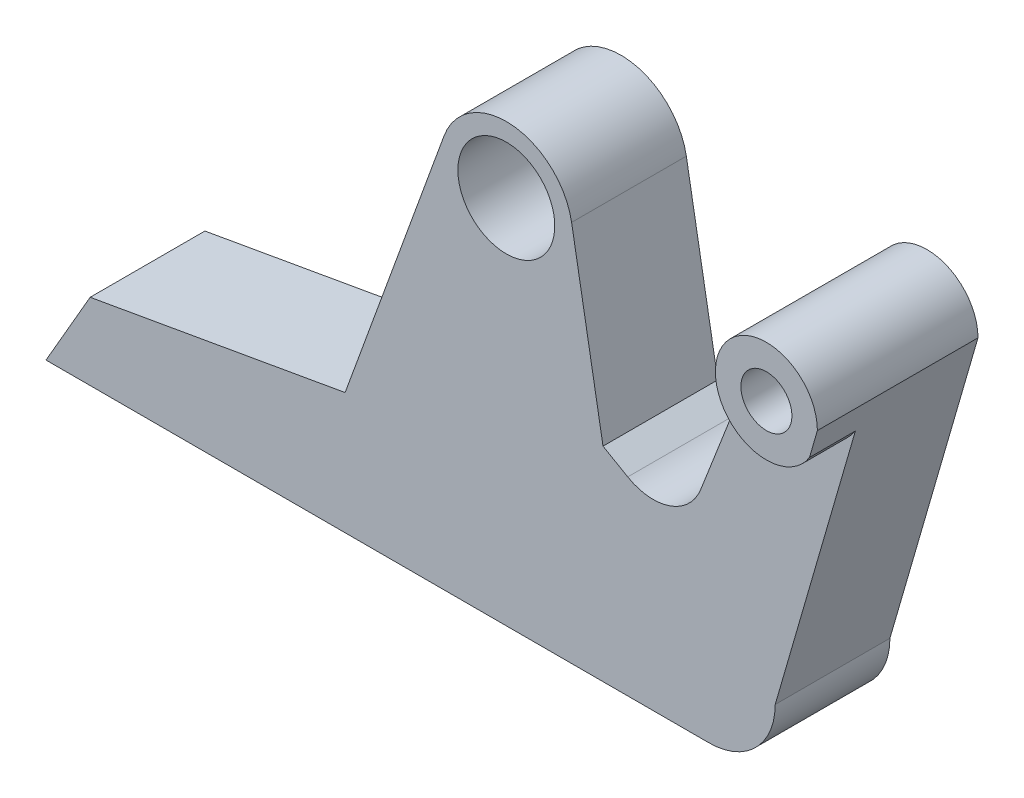
ISO-10303-21;
HEADER;
FILE_DESCRIPTION(('STEP AP214'),'2;1');
FILE_NAME('part.step','',(''),(''),'','','');
FILE_SCHEMA(('AUTOMOTIVE_DESIGN { 1 0 10303 214 1 1 1 1 }'));
ENDSEC;
DATA;
#1=APPLICATION_CONTEXT('core data for automotive mechanical design processes');
#2=APPLICATION_PROTOCOL_DEFINITION('international standard','automotive_design',2000,#1);
#3=PRODUCT_CONTEXT('',#1,'mechanical');
#4=PRODUCT('Part','Part','',(#3));
#5=PRODUCT_RELATED_PRODUCT_CATEGORY('part','',(#4));
#6=PRODUCT_DEFINITION_FORMATION('','',#4);
#7=PRODUCT_DEFINITION_CONTEXT('part definition',#1,'design');
#8=PRODUCT_DEFINITION('design','',#6,#7);
#9=PRODUCT_DEFINITION_SHAPE('','',#8);
#10=(LENGTH_UNIT() NAMED_UNIT(*) SI_UNIT(.MILLI.,.METRE.));
#11=(NAMED_UNIT(*) PLANE_ANGLE_UNIT() SI_UNIT($,.RADIAN.));
#12=(NAMED_UNIT(*) SI_UNIT($,.STERADIAN.) SOLID_ANGLE_UNIT());
#13=UNCERTAINTY_MEASURE_WITH_UNIT(LENGTH_MEASURE(1.E-05),#10,'distance_accuracy_value','');
#14=(GEOMETRIC_REPRESENTATION_CONTEXT(3) GLOBAL_UNCERTAINTY_ASSIGNED_CONTEXT((#13)) GLOBAL_UNIT_ASSIGNED_CONTEXT((#10,
#11,#12)) REPRESENTATION_CONTEXT('',''));
#15=CARTESIAN_POINT('',(0.,0.,0.));
#16=DIRECTION('',(0.,0.,1.));
#17=DIRECTION('',(1.,0.,0.));
#18=AXIS2_PLACEMENT_3D('',#15,#16,#17);
#19=CARTESIAN_POINT('',(0.,0.,22.5));
#20=DIRECTION('',(0.866025403784436,-0.500000000000004,0.));
#21=DIRECTION('',(0.500000000000004,0.866025403784436,0.));
#22=AXIS2_PLACEMENT_3D('',#19,#20,#21);
#23=PLANE('',#22);
#24=DIRECTION('',(-0.500000000000004,-0.866025403784436,0.));
#25=VECTOR('',#24,1.);
#26=CARTESIAN_POINT('',(0.,0.,8.24999999999999));
#27=LINE('',#26,#25);
#28=CARTESIAN_POINT('',(1.73205080756889,3.,8.24999999999999));
#29=VERTEX_POINT('',#28);
#30=CARTESIAN_POINT('',(0.,0.,8.24999999999999));
#31=VERTEX_POINT('',#30);
#32=EDGE_CURVE('E286',#29,#31,#27,.T.);
#33=ORIENTED_EDGE('',*,*,#32,.F.);
#34=DIRECTION('',(0.,0.,1.));
#35=VECTOR('',#34,1.);
#36=CARTESIAN_POINT('',(1.7320508075689,3.,22.5));
#37=LINE('',#36,#35);
#38=CARTESIAN_POINT('',(1.73205080756892,3.00000000000001,5.25));
#39=VERTEX_POINT('',#38);
#40=EDGE_CURVE('E385',#39,#29,#37,.T.);
#41=ORIENTED_EDGE('',*,*,#40,.F.);
#42=DIRECTION('',(-0.500000000000004,-0.866025403784436,0.));
#43=VECTOR('',#42,1.);
#44=CARTESIAN_POINT('',(0.,0.,5.25));
#45=LINE('',#44,#43);
#46=CARTESIAN_POINT('',(3.4641016151378,6.,5.25));
#47=VERTEX_POINT('',#46);
#48=EDGE_CURVE('E383',#47,#39,#45,.T.);
#49=ORIENTED_EDGE('',*,*,#48,.F.);
#50=DIRECTION('',(0.,0.,1.));
#51=VECTOR('',#50,1.);
#52=CARTESIAN_POINT('',(3.46410161513779,6.,22.5));
#53=LINE('',#52,#51);
#54=CARTESIAN_POINT('',(3.46410161513783,6.00000000000001,17.25));
#55=VERTEX_POINT('',#54);
#56=EDGE_CURVE('E380',#47,#55,#53,.T.);
#57=ORIENTED_EDGE('',*,*,#56,.T.);
#58=DIRECTION('',(-0.500000000000004,-0.866025403784436,0.));
#59=VECTOR('',#58,1.);
#60=CARTESIAN_POINT('',(0.,0.,17.25));
#61=LINE('',#60,#59);
#62=CARTESIAN_POINT('',(1.73205080756889,3.,17.25));
#63=VERTEX_POINT('',#62);
#64=EDGE_CURVE('E377',#55,#63,#61,.T.);
#65=ORIENTED_EDGE('',*,*,#64,.T.);
#66=DIRECTION('',(0.,0.,1.));
#67=VECTOR('',#66,1.);
#68=CARTESIAN_POINT('',(1.7320508075689,3.,22.5));
#69=LINE('',#68,#67);
#70=CARTESIAN_POINT('',(1.73205080756892,3.00000000000001,14.25));
#71=VERTEX_POINT('',#70);
#72=EDGE_CURVE('E375',#71,#63,#69,.T.);
#73=ORIENTED_EDGE('',*,*,#72,.F.);
#74=DIRECTION('',(-0.500000000000004,-0.866025403784436,0.));
#75=VECTOR('',#74,1.);
#76=CARTESIAN_POINT('',(0.,0.,14.25));
#77=LINE('',#76,#75);
#78=CARTESIAN_POINT('',(0.,0.,14.25));
#79=VERTEX_POINT('',#78);
#80=EDGE_CURVE('E264',#71,#79,#77,.T.);
#81=ORIENTED_EDGE('',*,*,#80,.T.);
#82=DIRECTION('',(0.,0.,-1.));
#83=VECTOR('',#82,1.);
#84=CARTESIAN_POINT('',(0.,0.,22.5));
#85=LINE('',#84,#83);
#86=CARTESIAN_POINT('',(0.,0.,22.5));
#87=VERTEX_POINT('',#86);
#88=EDGE_CURVE('E353',#87,#79,#85,.T.);
#89=ORIENTED_EDGE('',*,*,#88,.F.);
#90=DIRECTION('',(-0.500000000000004,-0.866025403784436,0.));
#91=VECTOR('',#90,1.);
#92=CARTESIAN_POINT('',(0.,0.,22.5));
#93=LINE('',#92,#91);
#94=CARTESIAN_POINT('',(8.66025403784448,15.,22.5));
#95=VERTEX_POINT('',#94);
#96=EDGE_CURVE('E309',#95,#87,#93,.T.);
#97=ORIENTED_EDGE('',*,*,#96,.F.);
#98=DIRECTION('',(0.,0.,-1.));
#99=VECTOR('',#98,1.);
#100=CARTESIAN_POINT('',(8.66025403784448,15.,22.5));
#101=LINE('',#100,#99);
#102=CARTESIAN_POINT('',(8.66025403784448,15.,0.));
#103=VERTEX_POINT('',#102);
#104=EDGE_CURVE('E356',#95,#103,#101,.T.);
#105=ORIENTED_EDGE('',*,*,#104,.T.);
#106=DIRECTION('',(-0.500000000000004,-0.866025403784436,0.));
#107=VECTOR('',#106,1.);
#108=CARTESIAN_POINT('',(0.,0.,0.));
#109=LINE('',#108,#107);
#110=CARTESIAN_POINT('',(0.,0.,0.));
#111=VERTEX_POINT('',#110);
#112=EDGE_CURVE('E338',#103,#111,#109,.T.);
#113=ORIENTED_EDGE('',*,*,#112,.T.);
#114=EDGE_CURVE('E352',#31,#111,#85,.T.);
#115=ORIENTED_EDGE('',*,*,#114,.F.);
#116=EDGE_LOOP('',(#33,#41,#49,#57,#65,#73,#81,#89,#97,#105,#113,#115));
#117=FACE_BOUND('',#116,.T.);
#118=ADVANCED_FACE('F75',(#117),#23,.F.);
#119=CARTESIAN_POINT('',(0.,0.,22.5));
#120=DIRECTION('',(0.,1.,0.));
#121=DIRECTION('',(-1.,0.,0.));
#122=AXIS2_PLACEMENT_3D('',#119,#120,#121);
#123=PLANE('',#122);
#124=DIRECTION('',(-1.,0.,0.));
#125=VECTOR('',#124,1.);
#126=CARTESIAN_POINT('',(130.,0.,8.24999999999999));
#127=LINE('',#126,#125);
#128=CARTESIAN_POINT('',(130.,0.,8.25));
#129=VERTEX_POINT('',#128);
#130=EDGE_CURVE('E261',#129,#31,#127,.T.);
#131=ORIENTED_EDGE('',*,*,#130,.T.);
#132=ORIENTED_EDGE('',*,*,#114,.T.);
#133=DIRECTION('',(1.,0.,0.));
#134=VECTOR('',#133,1.);
#135=CARTESIAN_POINT('',(0.,0.,0.));
#136=LINE('',#135,#134);
#137=CARTESIAN_POINT('',(130.,0.,0.));
#138=VERTEX_POINT('',#137);
#139=EDGE_CURVE('E341',#111,#138,#136,.T.);
#140=ORIENTED_EDGE('',*,*,#139,.T.);
#141=DIRECTION('',(0.,0.,-1.));
#142=VECTOR('',#141,1.);
#143=CARTESIAN_POINT('',(130.,0.,22.5));
#144=LINE('',#143,#142);
#145=EDGE_CURVE('E317',#129,#138,#144,.T.);
#146=ORIENTED_EDGE('',*,*,#145,.F.);
#147=EDGE_LOOP('',(#131,#132,#140,#146));
#148=FACE_BOUND('',#147,.T.);
#149=ADVANCED_FACE('F413',(#148),#123,.F.);
#150=CARTESIAN_POINT('',(130.,13.,22.5));
#151=DIRECTION('',(0.,0.,-1.));
#152=DIRECTION('',(-1.,0.,0.));
#153=AXIS2_PLACEMENT_3D('',#150,#151,#152);
#154=CYLINDRICAL_SURFACE('',#153,13.);
#155=CARTESIAN_POINT('',(130.,13.,0.));
#156=DIRECTION('',(0.,0.,1.));
#157=DIRECTION('',(1.,0.,0.));
#158=AXIS2_PLACEMENT_3D('',#155,#156,#157);
#159=CIRCLE('',#158,13.);
#160=CARTESIAN_POINT('',(143.,13.,0.));
#161=VERTEX_POINT('',#160);
#162=EDGE_CURVE('E288',#138,#161,#159,.T.);
#163=ORIENTED_EDGE('',*,*,#162,.T.);
#164=DIRECTION('',(0.,0.,-1.));
#165=VECTOR('',#164,1.);
#166=CARTESIAN_POINT('',(143.,13.,22.5));
#167=LINE('',#166,#165);
#168=CARTESIAN_POINT('',(143.,13.,22.5));
#169=VERTEX_POINT('',#168);
#170=EDGE_CURVE('E373',#169,#161,#167,.T.);
#171=ORIENTED_EDGE('',*,*,#170,.F.);
#172=CARTESIAN_POINT('',(130.,13.,22.5));
#173=DIRECTION('',(0.,0.,1.));
#174=DIRECTION('',(1.,0.,0.));
#175=AXIS2_PLACEMENT_3D('',#172,#173,#174);
#176=CIRCLE('',#175,13.);
#177=CARTESIAN_POINT('',(130.,0.,22.5));
#178=VERTEX_POINT('',#177);
#179=EDGE_CURVE('E289',#178,#169,#176,.T.);
#180=ORIENTED_EDGE('',*,*,#179,.F.);
#181=CARTESIAN_POINT('',(130.,0.,14.25));
#182=VERTEX_POINT('',#181);
#183=EDGE_CURVE('E349',#178,#182,#144,.T.);
#184=ORIENTED_EDGE('',*,*,#183,.T.);
#185=DIRECTION('',(0.,0.,-1.));
#186=VECTOR('',#185,1.);
#187=CARTESIAN_POINT('',(130.,0.,0.));
#188=LINE('',#187,#186);
#189=EDGE_CURVE('E238',#182,#129,#188,.T.);
#190=ORIENTED_EDGE('',*,*,#189,.T.);
#191=ORIENTED_EDGE('',*,*,#145,.T.);
#192=EDGE_LOOP('',(#163,#171,#180,#184,#190,#191));
#193=FACE_BOUND('',#192,.T.);
#194=ADVANCED_FACE('F419',(#193),#154,.T.);
#195=CARTESIAN_POINT('',(150.274249999417,72.6656318764519,22.5));
#196=DIRECTION('',(0.,0.,-1.));
#197=DIRECTION('',(-1.,0.,0.));
#198=AXIS2_PLACEMENT_3D('',#195,#196,#197);
#199=CYLINDRICAL_SURFACE('',#198,4.99999999999999);
#200=CARTESIAN_POINT('',(150.274249999417,72.6656318764519,0.));
#201=DIRECTION('',(0.,0.,1.));
#202=DIRECTION('',(1.,0.,0.));
#203=AXIS2_PLACEMENT_3D('',#200,#201,#202);
#204=CIRCLE('',#203,4.99999999999999);
#205=CARTESIAN_POINT('',(145.274249999417,72.6656318764519,0.));
#206=VERTEX_POINT('',#205);
#207=EDGE_CURVE('E293',#206,#206,#204,.T.);
#208=CARTESIAN_POINT('',(150.274249999417,72.6656318764519,31.5));
#209=DIRECTION('',(0.,0.,1.));
#210=DIRECTION('',(1.,0.,0.));
#211=AXIS2_PLACEMENT_3D('',#208,#209,#210);
#212=CIRCLE('',#211,4.99999999999999);
#213=CARTESIAN_POINT('',(145.274249999417,72.6656318764519,31.5));
#214=VERTEX_POINT('',#213);
#215=EDGE_CURVE('E234',#214,#214,#212,.F.);
#216=CARTESIAN_POINT('',(145.274249999417,72.6656318764519,0.));
#217=CARTESIAN_POINT('',(145.274249999417,72.6656318764519,0.328124999999997));
#218=CARTESIAN_POINT('',(145.274249999417,72.6656318764519,0.656249999999996));
#219=CARTESIAN_POINT('',(145.274249999417,72.6656318764519,1.3125));
#220=CARTESIAN_POINT('',(145.274249999417,72.6656318764519,1.640625));
#221=CARTESIAN_POINT('',(145.274249999417,72.6656318764519,2.296875));
#222=CARTESIAN_POINT('',(145.274249999417,72.6656318764519,2.625));
#223=CARTESIAN_POINT('',(145.274249999417,72.6656318764519,3.28125));
#224=CARTESIAN_POINT('',(145.274249999417,72.6656318764519,3.609375));
#225=CARTESIAN_POINT('',(145.274249999417,72.6656318764519,4.265625));
#226=CARTESIAN_POINT('',(145.274249999417,72.6656318764519,4.59375));
#227=CARTESIAN_POINT('',(145.274249999417,72.6656318764519,5.25));
#228=CARTESIAN_POINT('',(145.274249999417,72.6656318764519,5.578125));
#229=CARTESIAN_POINT('',(145.274249999417,72.6656318764519,6.234375));
#230=CARTESIAN_POINT('',(145.274249999417,72.6656318764519,6.5625));
#231=CARTESIAN_POINT('',(145.274249999417,72.6656318764519,7.21875));
#232=CARTESIAN_POINT('',(145.274249999417,72.6656318764519,7.546875));
#233=CARTESIAN_POINT('',(145.274249999417,72.6656318764519,8.20312499999999));
#234=CARTESIAN_POINT('',(145.274249999417,72.6656318764519,8.53124999999999));
#235=CARTESIAN_POINT('',(145.274249999417,72.6656318764519,9.18749999999999));
#236=CARTESIAN_POINT('',(145.274249999417,72.6656318764519,9.51562499999999));
#237=CARTESIAN_POINT('',(145.274249999417,72.6656318764519,10.171875));
#238=CARTESIAN_POINT('',(145.274249999417,72.6656318764519,10.5));
#239=CARTESIAN_POINT('',(145.274249999417,72.6656318764519,11.15625));
#240=CARTESIAN_POINT('',(145.274249999417,72.6656318764519,11.484375));
#241=CARTESIAN_POINT('',(145.274249999417,72.6656318764519,12.140625));
#242=CARTESIAN_POINT('',(145.274249999417,72.6656318764519,12.46875));
#243=CARTESIAN_POINT('',(145.274249999417,72.6656318764519,13.125));
#244=CARTESIAN_POINT('',(145.274249999417,72.6656318764519,13.453125));
#245=CARTESIAN_POINT('',(145.274249999417,72.6656318764519,14.109375));
#246=CARTESIAN_POINT('',(145.274249999417,72.6656318764519,14.4375));
#247=CARTESIAN_POINT('',(145.274249999417,72.6656318764519,15.09375));
#248=CARTESIAN_POINT('',(145.274249999417,72.6656318764519,15.421875));
#249=CARTESIAN_POINT('',(145.274249999417,72.6656318764519,16.078125));
#250=CARTESIAN_POINT('',(145.274249999417,72.6656318764519,16.40625));
#251=CARTESIAN_POINT('',(145.274249999417,72.6656318764519,17.0625));
#252=CARTESIAN_POINT('',(145.274249999417,72.6656318764519,17.390625));
#253=CARTESIAN_POINT('',(145.274249999417,72.6656318764519,18.046875));
#254=CARTESIAN_POINT('',(145.274249999417,72.6656318764519,18.375));
#255=CARTESIAN_POINT('',(145.274249999417,72.6656318764519,19.03125));
#256=CARTESIAN_POINT('',(145.274249999417,72.6656318764519,19.359375));
#257=CARTESIAN_POINT('',(145.274249999417,72.6656318764519,20.015625));
#258=CARTESIAN_POINT('',(145.274249999417,72.6656318764519,20.34375));
#259=CARTESIAN_POINT('',(145.274249999417,72.6656318764519,21.));
#260=CARTESIAN_POINT('',(145.274249999417,72.6656318764519,21.328125));
#261=CARTESIAN_POINT('',(145.274249999417,72.6656318764519,21.984375));
#262=CARTESIAN_POINT('',(145.274249999417,72.6656318764519,22.3125));
#263=CARTESIAN_POINT('',(145.274249999417,72.6656318764519,22.96875));
#264=CARTESIAN_POINT('',(145.274249999417,72.6656318764519,23.296875));
#265=CARTESIAN_POINT('',(145.274249999417,72.6656318764519,23.953125));
#266=CARTESIAN_POINT('',(145.274249999417,72.6656318764519,24.28125));
#267=CARTESIAN_POINT('',(145.274249999417,72.6656318764519,24.9375));
#268=CARTESIAN_POINT('',(145.274249999417,72.6656318764519,25.265625));
#269=CARTESIAN_POINT('',(145.274249999417,72.6656318764519,25.921875));
#270=CARTESIAN_POINT('',(145.274249999417,72.6656318764519,26.25));
#271=CARTESIAN_POINT('',(145.274249999417,72.6656318764519,26.90625));
#272=CARTESIAN_POINT('',(145.274249999417,72.6656318764519,27.234375));
#273=CARTESIAN_POINT('',(145.274249999417,72.6656318764519,27.890625));
#274=CARTESIAN_POINT('',(145.274249999417,72.6656318764519,28.21875));
#275=CARTESIAN_POINT('',(145.274249999417,72.6656318764519,28.875));
#276=CARTESIAN_POINT('',(145.274249999417,72.6656318764519,29.203125));
#277=CARTESIAN_POINT('',(145.274249999417,72.6656318764519,29.859375));
#278=CARTESIAN_POINT('',(145.274249999417,72.6656318764519,30.1875));
#279=CARTESIAN_POINT('',(145.274249999417,72.6656318764519,30.84375));
#280=CARTESIAN_POINT('',(145.274249999417,72.6656318764519,31.171875));
#281=CARTESIAN_POINT('',(145.274249999417,72.6656318764519,31.5));
#282=B_SPLINE_CURVE_WITH_KNOTS('',3,(#216,#217,#218,#219,#220,#221,#222,#223,#224,#225,#226,
#227,#228,#229,#230,#231,#232,#233,#234,#235,#236,#237,#238,#239,#240,#241,#242,#243,#244,#245,
#246,#247,#248,#249,#250,#251,#252,#253,#254,#255,#256,#257,#258,#259,#260,#261,#262,#263,#264,
#265,#266,#267,#268,#269,#270,#271,#272,#273,#274,#275,#276,#277,#278,#279,#280,#281),
.UNSPECIFIED.,.F.,.F.,(4,2,2,2,2,2,2,2,2,2,2,2,2,2,2,2,2,2,2,2,2,2,2,2,2,2,2,2,2,2,2,2,4),(0.,
0.984374999999999,1.96875,2.953125,3.9375,4.921875,5.90625,6.890625,7.875,8.859375,9.84375,
10.828125,11.8125,12.796875,13.78125,14.765625,15.75,16.734375,17.71875,18.703125,19.6875,
20.671875,21.65625,22.640625,23.625,24.609375,25.59375,26.578125,27.5625,28.546875,29.53125,
30.515625,31.5),.UNSPECIFIED.);
#283=EDGE_CURVE('BSEAM423',#206,#214,#282,.T.);
#284=ORIENTED_EDGE('',*,*,#207,.F.);
#285=ORIENTED_EDGE('',*,*,#215,.F.);
#286=ORIENTED_EDGE('',*,*,#283,.T.);
#287=ORIENTED_EDGE('',*,*,#283,.F.);
#288=EDGE_LOOP('',(#284,#286,#285,#287));
#289=FACE_BOUND('',#288,.T.);
#290=ADVANCED_FACE('F423',(#289),#199,.F.);
#291=CARTESIAN_POINT('',(90.2742499994169,72.6656318764519,22.5));
#292=DIRECTION('',(0.,0.,-1.));
#293=DIRECTION('',(-1.,0.,0.));
#294=AXIS2_PLACEMENT_3D('',#291,#292,#293);
#295=CYLINDRICAL_SURFACE('',#294,9.49999999999999);
#296=CARTESIAN_POINT('',(90.2742499994169,72.6656318764519,22.5));
#297=DIRECTION('',(0.,0.,1.));
#298=DIRECTION('',(1.,0.,0.));
#299=AXIS2_PLACEMENT_3D('',#296,#297,#298);
#300=CIRCLE('',#299,9.49999999999999);
#301=CARTESIAN_POINT('',(80.7742499994169,72.6656318764519,22.5));
#302=VERTEX_POINT('',#301);
#303=EDGE_CURVE('E314',#302,#302,#300,.T.);
#304=CARTESIAN_POINT('',(90.2742499994169,72.6656318764519,0.));
#305=DIRECTION('',(0.,0.,1.));
#306=DIRECTION('',(1.,0.,0.));
#307=AXIS2_PLACEMENT_3D('',#304,#305,#306);
#308=CIRCLE('',#307,9.49999999999999);
#309=CARTESIAN_POINT('',(80.7742499994169,72.6656318764519,0.));
#310=VERTEX_POINT('',#309);
#311=EDGE_CURVE('E344',#310,#310,#308,.T.);
#312=CARTESIAN_POINT('',(80.7742499994169,72.6656318764519,22.5));
#313=CARTESIAN_POINT('',(80.7742499994169,72.6656318764519,22.265625));
#314=CARTESIAN_POINT('',(80.7742499994169,72.6656318764519,22.03125));
#315=CARTESIAN_POINT('',(80.7742499994169,72.6656318764519,21.5625));
#316=CARTESIAN_POINT('',(80.7742499994169,72.6656318764519,21.328125));
#317=CARTESIAN_POINT('',(80.7742499994169,72.6656318764519,20.859375));
#318=CARTESIAN_POINT('',(80.7742499994169,72.6656318764519,20.625));
#319=CARTESIAN_POINT('',(80.7742499994169,72.6656318764519,20.15625));
#320=CARTESIAN_POINT('',(80.7742499994169,72.6656318764519,19.921875));
#321=CARTESIAN_POINT('',(80.7742499994169,72.6656318764519,19.453125));
#322=CARTESIAN_POINT('',(80.7742499994169,72.6656318764519,19.21875));
#323=CARTESIAN_POINT('',(80.7742499994169,72.6656318764519,18.75));
#324=CARTESIAN_POINT('',(80.7742499994169,72.6656318764519,18.515625));
#325=CARTESIAN_POINT('',(80.7742499994169,72.6656318764519,18.046875));
#326=CARTESIAN_POINT('',(80.7742499994169,72.6656318764519,17.8125));
#327=CARTESIAN_POINT('',(80.7742499994169,72.6656318764519,17.34375));
#328=CARTESIAN_POINT('',(80.7742499994169,72.6656318764519,17.109375));
#329=CARTESIAN_POINT('',(80.7742499994169,72.6656318764519,16.640625));
#330=CARTESIAN_POINT('',(80.7742499994169,72.6656318764519,16.40625));
#331=CARTESIAN_POINT('',(80.7742499994169,72.6656318764519,15.9375));
#332=CARTESIAN_POINT('',(80.7742499994169,72.6656318764519,15.703125));
#333=CARTESIAN_POINT('',(80.7742499994169,72.6656318764519,15.234375));
#334=CARTESIAN_POINT('',(80.7742499994169,72.6656318764519,15.));
#335=CARTESIAN_POINT('',(80.7742499994169,72.6656318764519,14.53125));
#336=CARTESIAN_POINT('',(80.7742499994169,72.6656318764519,14.296875));
#337=CARTESIAN_POINT('',(80.7742499994169,72.6656318764519,13.828125));
#338=CARTESIAN_POINT('',(80.7742499994169,72.6656318764519,13.59375));
#339=CARTESIAN_POINT('',(80.7742499994169,72.6656318764519,13.125));
#340=CARTESIAN_POINT('',(80.7742499994169,72.6656318764519,12.890625));
#341=CARTESIAN_POINT('',(80.7742499994169,72.6656318764519,12.421875));
#342=CARTESIAN_POINT('',(80.7742499994169,72.6656318764519,12.1875));
#343=CARTESIAN_POINT('',(80.7742499994169,72.6656318764519,11.71875));
#344=CARTESIAN_POINT('',(80.7742499994169,72.6656318764519,11.484375));
#345=CARTESIAN_POINT('',(80.7742499994169,72.6656318764519,11.015625));
#346=CARTESIAN_POINT('',(80.7742499994169,72.6656318764519,10.78125));
#347=CARTESIAN_POINT('',(80.7742499994169,72.6656318764519,10.3125));
#348=CARTESIAN_POINT('',(80.7742499994169,72.6656318764519,10.078125));
#349=CARTESIAN_POINT('',(80.7742499994169,72.6656318764519,9.609375));
#350=CARTESIAN_POINT('',(80.7742499994169,72.6656318764519,9.375));
#351=CARTESIAN_POINT('',(80.7742499994169,72.6656318764519,8.90625));
#352=CARTESIAN_POINT('',(80.7742499994169,72.6656318764519,8.671875));
#353=CARTESIAN_POINT('',(80.7742499994169,72.6656318764519,8.203125));
#354=CARTESIAN_POINT('',(80.7742499994169,72.6656318764519,7.96875));
#355=CARTESIAN_POINT('',(80.7742499994169,72.6656318764519,7.5));
#356=CARTESIAN_POINT('',(80.7742499994169,72.6656318764519,7.265625));
#357=CARTESIAN_POINT('',(80.7742499994169,72.6656318764519,6.796875));
#358=CARTESIAN_POINT('',(80.7742499994169,72.6656318764519,6.5625));
#359=CARTESIAN_POINT('',(80.7742499994169,72.6656318764519,6.09375));
#360=CARTESIAN_POINT('',(80.7742499994169,72.6656318764519,5.859375));
#361=CARTESIAN_POINT('',(80.7742499994169,72.6656318764519,5.390625));
#362=CARTESIAN_POINT('',(80.7742499994169,72.6656318764519,5.15625));
#363=CARTESIAN_POINT('',(80.7742499994169,72.6656318764519,4.6875));
#364=CARTESIAN_POINT('',(80.7742499994169,72.6656318764519,4.453125));
#365=CARTESIAN_POINT('',(80.7742499994169,72.6656318764519,3.984375));
#366=CARTESIAN_POINT('',(80.7742499994169,72.6656318764519,3.75));
#367=CARTESIAN_POINT('',(80.7742499994169,72.6656318764519,3.28125));
#368=CARTESIAN_POINT('',(80.7742499994169,72.6656318764519,3.046875));
#369=CARTESIAN_POINT('',(80.7742499994169,72.6656318764519,2.578125));
#370=CARTESIAN_POINT('',(80.7742499994169,72.6656318764519,2.34375));
#371=CARTESIAN_POINT('',(80.7742499994169,72.6656318764519,1.875));
#372=CARTESIAN_POINT('',(80.7742499994169,72.6656318764519,1.640625));
#373=CARTESIAN_POINT('',(80.7742499994169,72.6656318764519,1.171875));
#374=CARTESIAN_POINT('',(80.7742499994169,72.6656318764519,0.937499999999996));
#375=CARTESIAN_POINT('',(80.7742499994169,72.6656318764519,0.468749999999996));
#376=CARTESIAN_POINT('',(80.7742499994169,72.6656318764519,0.234374999999996));
#377=CARTESIAN_POINT('',(80.7742499994169,72.6656318764519,0.));
#378=B_SPLINE_CURVE_WITH_KNOTS('',3,(#312,#313,#314,#315,#316,#317,#318,#319,#320,#321,#322,
#323,#324,#325,#326,#327,#328,#329,#330,#331,#332,#333,#334,#335,#336,#337,#338,#339,#340,#341,
#342,#343,#344,#345,#346,#347,#348,#349,#350,#351,#352,#353,#354,#355,#356,#357,#358,#359,#360,
#361,#362,#363,#364,#365,#366,#367,#368,#369,#370,#371,#372,#373,#374,#375,#376,#377),
.UNSPECIFIED.,.F.,.F.,(4,2,2,2,2,2,2,2,2,2,2,2,2,2,2,2,2,2,2,2,2,2,2,2,2,2,2,2,2,2,2,2,4),(0.,
0.703124999999999,1.40625,2.109375,2.8125,3.515625,4.21875,4.921875,5.625,6.328125,7.03125,
7.734375,8.4375,9.140625,9.84375,10.546875,11.25,11.953125,12.65625,13.359375,14.0625,14.765625,
15.46875,16.171875,16.875,17.578125,18.28125,18.984375,19.6875,20.390625,21.09375,21.796875,
22.5),.UNSPECIFIED.);
#379=EDGE_CURVE('BSEAM451',#302,#310,#378,.T.);
#380=ORIENTED_EDGE('',*,*,#303,.T.);
#381=ORIENTED_EDGE('',*,*,#311,.F.);
#382=ORIENTED_EDGE('',*,*,#379,.T.);
#383=ORIENTED_EDGE('',*,*,#379,.F.);
#384=EDGE_LOOP('',(#380,#382,#381,#383));
#385=FACE_BOUND('',#384,.T.);
#386=ADVANCED_FACE('F451',(#385),#295,.F.);
#387=CARTESIAN_POINT('',(128.46802548352,-37.193753243559,22.5));
#388=DIRECTION('',(0.960552999077482,-0.27809699020891,0.));
#389=DIRECTION('',(0.27809699020891,0.960552999077482,0.));
#390=AXIS2_PLACEMENT_3D('',#387,#388,#389);
#391=PLANE('',#390);
#392=DIRECTION('',(-0.27809699020891,-0.960552999077482,0.));
#393=VECTOR('',#392,1.);
#394=CARTESIAN_POINT('',(128.46802548352,-37.193753243559,0.));
#395=LINE('',#394,#393);
#396=CARTESIAN_POINT('',(160.274249999417,72.6656318764519,0.));
#397=VERTEX_POINT('',#396);
#398=EDGE_CURVE('E320',#397,#161,#395,.T.);
#399=ORIENTED_EDGE('',*,*,#398,.F.);
#400=DIRECTION('',(0.,0.,-1.));
#401=VECTOR('',#400,1.);
#402=CARTESIAN_POINT('',(160.274249999417,72.6656318764519,22.5));
#403=LINE('',#402,#401);
#404=CARTESIAN_POINT('',(160.274249999417,72.6656318764519,31.5));
#405=VERTEX_POINT('',#404);
#406=EDGE_CURVE('E227',#405,#397,#403,.T.);
#407=ORIENTED_EDGE('',*,*,#406,.F.);
#408=DIRECTION('',(0.27809699020891,0.960552999077482,0.));
#409=VECTOR('',#408,1.);
#410=CARTESIAN_POINT('',(128.46802548352,-37.193753243559,31.5));
#411=LINE('',#410,#409);
#412=CARTESIAN_POINT('',(158.727491280152,67.3230939168601,31.5));
#413=VERTEX_POINT('',#412);
#414=EDGE_CURVE('E221',#413,#405,#411,.T.);
#415=ORIENTED_EDGE('',*,*,#414,.F.);
#416=DIRECTION('',(0.,0.,-1.));
#417=VECTOR('',#416,1.);
#418=CARTESIAN_POINT('',(158.727491280152,67.3230939168601,31.5));
#419=LINE('',#418,#417);
#420=CARTESIAN_POINT('',(158.727491280152,67.3230939168601,22.5));
#421=VERTEX_POINT('',#420);
#422=EDGE_CURVE('E226',#413,#421,#419,.T.);
#423=ORIENTED_EDGE('',*,*,#422,.T.);
#424=DIRECTION('',(-0.27809699020891,-0.960552999077482,0.));
#425=VECTOR('',#424,1.);
#426=CARTESIAN_POINT('',(128.46802548352,-37.193753243559,22.5));
#427=LINE('',#426,#425);
#428=EDGE_CURVE('E292',#421,#169,#427,.T.);
#429=ORIENTED_EDGE('',*,*,#428,.T.);
#430=ORIENTED_EDGE('',*,*,#170,.T.);
#431=EDGE_LOOP('',(#399,#407,#415,#423,#429,#430));
#432=FACE_BOUND('',#431,.T.);
#433=ADVANCED_FACE('F224',(#432),#391,.T.);
#434=CARTESIAN_POINT('',(150.274249999417,72.6656318764519,22.5));
#435=DIRECTION('',(0.,0.,-1.));
#436=DIRECTION('',(-1.,0.,0.));
#437=AXIS2_PLACEMENT_3D('',#434,#435,#436);
#438=CYLINDRICAL_SURFACE('',#437,10.);
#439=CARTESIAN_POINT('',(150.274249999417,72.6656318764519,0.));
#440=DIRECTION('',(0.,0.,1.));
#441=DIRECTION('',(1.,0.,0.));
#442=AXIS2_PLACEMENT_3D('',#439,#440,#441);
#443=CIRCLE('',#442,10.);
#444=CARTESIAN_POINT('',(140.274249999417,72.6656318764519,0.));
#445=VERTEX_POINT('',#444);
#446=EDGE_CURVE('E323',#397,#445,#443,.T.);
#447=ORIENTED_EDGE('',*,*,#446,.T.);
#448=DIRECTION('',(0.,0.,-1.));
#449=VECTOR('',#448,1.);
#450=CARTESIAN_POINT('',(140.274249999417,72.6656318764519,22.5));
#451=LINE('',#450,#449);
#452=CARTESIAN_POINT('',(140.274249999417,72.6656318764519,22.5));
#453=VERTEX_POINT('',#452);
#454=EDGE_CURVE('E369',#453,#445,#451,.T.);
#455=ORIENTED_EDGE('',*,*,#454,.F.);
#456=CARTESIAN_POINT('',(150.274249999417,72.6656318764519,22.5));
#457=DIRECTION('',(0.,0.,1.));
#458=DIRECTION('',(1.,0.,0.));
#459=AXIS2_PLACEMENT_3D('',#456,#457,#458);
#460=CIRCLE('',#459,10.);
#461=EDGE_CURVE('E12',#453,#421,#460,.T.);
#462=ORIENTED_EDGE('',*,*,#461,.T.);
#463=ORIENTED_EDGE('',*,*,#422,.F.);
#464=CARTESIAN_POINT('',(150.274249999417,72.6656318764519,31.5));
#465=DIRECTION('',(0.,0.,1.));
#466=DIRECTION('',(1.,0.,0.));
#467=AXIS2_PLACEMENT_3D('',#464,#465,#466);
#468=CIRCLE('',#467,10.);
#469=EDGE_CURVE('E230',#405,#413,#468,.T.);
#470=ORIENTED_EDGE('',*,*,#469,.F.);
#471=ORIENTED_EDGE('',*,*,#406,.T.);
#472=EDGE_LOOP('',(#447,#455,#462,#463,#470,#471));
#473=FACE_BOUND('',#472,.T.);
#474=ADVANCED_FACE('F236',(#473),#438,.T.);
#475=CARTESIAN_POINT('',(97.1470145889608,-37.8949125842213,22.5));
#476=DIRECTION('',(0.931629956112682,-0.363408344529238,0.));
#477=DIRECTION('',(0.363408344529238,0.931629956112682,0.));
#478=AXIS2_PLACEMENT_3D('',#475,#476,#477);
#479=PLANE('',#478);
#480=DIRECTION('',(-0.363408344529238,-0.931629956112683,0.));
#481=VECTOR('',#480,1.);
#482=CARTESIAN_POINT('',(97.1470145889608,-37.8949125842213,0.));
#483=LINE('',#482,#481);
#484=CARTESIAN_POINT('',(128.400519825275,42.2262573063394,0.));
#485=VERTEX_POINT('',#484);
#486=EDGE_CURVE('E325',#445,#485,#483,.T.);
#487=ORIENTED_EDGE('',*,*,#486,.T.);
#488=DIRECTION('',(0.,0.,-1.));
#489=VECTOR('',#488,1.);
#490=CARTESIAN_POINT('',(128.400519825275,42.2262573063394,22.5));
#491=LINE('',#490,#489);
#492=CARTESIAN_POINT('',(128.400519825275,42.2262573063394,22.5));
#493=VERTEX_POINT('',#492);
#494=EDGE_CURVE('E91',#485,#493,#491,.F.);
#495=ORIENTED_EDGE('',*,*,#494,.T.);
#496=DIRECTION('',(-0.363408344529238,-0.931629956112683,0.));
#497=VECTOR('',#496,1.);
#498=CARTESIAN_POINT('',(97.1470145889608,-37.8949125842213,22.5));
#499=LINE('',#498,#497);
#500=EDGE_CURVE('E295',#453,#493,#499,.T.);
#501=ORIENTED_EDGE('',*,*,#500,.F.);
#502=ORIENTED_EDGE('',*,*,#454,.T.);
#503=EDGE_LOOP('',(#487,#495,#501,#502));
#504=FACE_BOUND('',#503,.T.);
#505=ADVANCED_FACE('F445',(#504),#479,.F.);
#506=CARTESIAN_POINT('',(44.6291651245991,77.2999814951863,22.5));
#507=DIRECTION('',(0.500000000000001,0.866025403784438,0.));
#508=DIRECTION('',(-0.866025403784438,0.500000000000002,0.));
#509=AXIS2_PLACEMENT_3D('',#506,#507,#508);
#510=PLANE('',#509);
#511=DIRECTION('',(0.866025403784438,-0.500000000000001,0.));
#512=VECTOR('',#511,1.);
#513=CARTESIAN_POINT('',(44.6291651245991,77.2999814951863,22.5));
#514=LINE('',#513,#512);
#515=CARTESIAN_POINT('',(109.23462819564,40.,22.5));
#516=VERTEX_POINT('',#515);
#517=CARTESIAN_POINT('',(114.084220264148,37.2000867137874,22.5));
#518=VERTEX_POINT('',#517);
#519=EDGE_CURVE('E297',#516,#518,#514,.T.);
#520=ORIENTED_EDGE('',*,*,#519,.T.);
#521=DIRECTION('',(0.,0.,-1.));
#522=VECTOR('',#521,1.);
#523=CARTESIAN_POINT('',(114.084220264148,37.2000867137874,22.5));
#524=LINE('',#523,#522);
#525=CARTESIAN_POINT('',(114.084220264148,37.2000867137874,0.));
#526=VERTEX_POINT('',#525);
#527=EDGE_CURVE('E387',#518,#526,#524,.T.);
#528=ORIENTED_EDGE('',*,*,#527,.T.);
#529=DIRECTION('',(0.866025403784438,-0.500000000000001,0.));
#530=VECTOR('',#529,1.);
#531=CARTESIAN_POINT('',(44.6291651245991,77.2999814951863,0.));
#532=LINE('',#531,#530);
#533=CARTESIAN_POINT('',(109.23462819564,40.,0.));
#534=VERTEX_POINT('',#533);
#535=EDGE_CURVE('E327',#534,#526,#532,.T.);
#536=ORIENTED_EDGE('',*,*,#535,.F.);
#537=DIRECTION('',(0.,0.,-1.));
#538=VECTOR('',#537,1.);
#539=CARTESIAN_POINT('',(109.23462819564,40.,22.5));
#540=LINE('',#539,#538);
#541=EDGE_CURVE('E367',#516,#534,#540,.T.);
#542=ORIENTED_EDGE('',*,*,#541,.F.);
#543=EDGE_LOOP('',(#520,#528,#536,#542));
#544=FACE_BOUND('',#543,.T.);
#545=ADVANCED_FACE('F399',(#544),#510,.T.);
#546=CARTESIAN_POINT('',(112.781203989201,19.886369180081,22.5));
#547=DIRECTION('',(0.984807753012208,0.173648177666928,0.));
#548=DIRECTION('',(-0.173648177666928,0.984807753012209,0.));
#549=AXIS2_PLACEMENT_3D('',#546,#547,#548);
#550=PLANE('',#549);
#551=DIRECTION('',(0.173648177666928,-0.984807753012209,0.));
#552=VECTOR('',#551,1.);
#553=CARTESIAN_POINT('',(112.781203989201,19.886369180081,0.));
#554=LINE('',#553,#552);
#555=CARTESIAN_POINT('',(103.076750788576,74.9230581861219,0.));
#556=VERTEX_POINT('',#555);
#557=EDGE_CURVE('E329',#556,#534,#554,.T.);
#558=ORIENTED_EDGE('',*,*,#557,.F.);
#559=DIRECTION('',(0.,0.,-1.));
#560=VECTOR('',#559,1.);
#561=CARTESIAN_POINT('',(103.076750788576,74.9230581861219,22.5));
#562=LINE('',#561,#560);
#563=CARTESIAN_POINT('',(103.076750788576,74.9230581861219,22.5));
#564=VERTEX_POINT('',#563);
#565=EDGE_CURVE('E365',#564,#556,#562,.T.);
#566=ORIENTED_EDGE('',*,*,#565,.F.);
#567=DIRECTION('',(0.173648177666928,-0.984807753012209,0.));
#568=VECTOR('',#567,1.);
#569=CARTESIAN_POINT('',(112.781203989201,19.886369180081,22.5));
#570=LINE('',#569,#568);
#571=EDGE_CURVE('E300',#564,#516,#570,.T.);
#572=ORIENTED_EDGE('',*,*,#571,.T.);
#573=ORIENTED_EDGE('',*,*,#541,.T.);
#574=EDGE_LOOP('',(#558,#566,#572,#573));
#575=FACE_BOUND('',#574,.T.);
#576=ADVANCED_FACE('F438',(#575),#550,.T.);
#577=CARTESIAN_POINT('',(90.2742499994169,72.6656318764519,22.5));
#578=DIRECTION('',(0.,0.,-1.));
#579=DIRECTION('',(-1.,0.,0.));
#580=AXIS2_PLACEMENT_3D('',#577,#578,#579);
#581=CYLINDRICAL_SURFACE('',#580,13.);
#582=CARTESIAN_POINT('',(90.2742499994169,72.6656318764519,0.));
#583=DIRECTION('',(0.,0.,1.));
#584=DIRECTION('',(1.,0.,0.));
#585=AXIS2_PLACEMENT_3D('',#582,#583,#584);
#586=CIRCLE('',#585,13.);
#587=CARTESIAN_POINT('',(78.0582459292001,77.1118937396856,0.));
#588=VERTEX_POINT('',#587);
#589=EDGE_CURVE('E332',#556,#588,#586,.T.);
#590=ORIENTED_EDGE('',*,*,#589,.T.);
#591=DIRECTION('',(0.,0.,-1.));
#592=VECTOR('',#591,1.);
#593=CARTESIAN_POINT('',(78.0582459292001,77.1118937396856,22.5));
#594=LINE('',#593,#592);
#595=CARTESIAN_POINT('',(78.0582459292001,77.1118937396856,22.5));
#596=VERTEX_POINT('',#595);
#597=EDGE_CURVE('E362',#596,#588,#594,.T.);
#598=ORIENTED_EDGE('',*,*,#597,.F.);
#599=CARTESIAN_POINT('',(90.2742499994169,72.6656318764519,22.5));
#600=DIRECTION('',(0.,0.,1.));
#601=DIRECTION('',(1.,0.,0.));
#602=AXIS2_PLACEMENT_3D('',#599,#600,#601);
#603=CIRCLE('',#602,13.);
#604=EDGE_CURVE('E303',#564,#596,#603,.T.);
#605=ORIENTED_EDGE('',*,*,#604,.F.);
#606=ORIENTED_EDGE('',*,*,#565,.T.);
#607=EDGE_LOOP('',(#590,#598,#605,#606));
#608=FACE_BOUND('',#607,.T.);
#609=ADVANCED_FACE('F434',(#608),#581,.T.);
#610=CARTESIAN_POINT('',(44.1438808037713,-16.0670586375682,22.5));
#611=DIRECTION('',(0.939692620785907,-0.342020143325673,0.));
#612=DIRECTION('',(0.342020143325673,0.939692620785907,0.));
#613=AXIS2_PLACEMENT_3D('',#610,#611,#612);
#614=PLANE('',#613);
#615=DIRECTION('',(-0.342020143325673,-0.939692620785907,0.));
#616=VECTOR('',#615,1.);
#617=CARTESIAN_POINT('',(44.1438808037713,-16.0670586375682,0.));
#618=LINE('',#617,#616);
#619=CARTESIAN_POINT('',(58.6602540378445,23.8163490354229,0.));
#620=VERTEX_POINT('',#619);
#621=EDGE_CURVE('E334',#588,#620,#618,.T.);
#622=ORIENTED_EDGE('',*,*,#621,.T.);
#623=DIRECTION('',(0.,0.,-1.));
#624=VECTOR('',#623,1.);
#625=CARTESIAN_POINT('',(58.6602540378445,23.8163490354229,22.5));
#626=LINE('',#625,#624);
#627=CARTESIAN_POINT('',(58.6602540378445,23.8163490354229,22.5));
#628=VERTEX_POINT('',#627);
#629=EDGE_CURVE('E359',#628,#620,#626,.T.);
#630=ORIENTED_EDGE('',*,*,#629,.F.);
#631=DIRECTION('',(-0.342020143325673,-0.939692620785907,0.));
#632=VECTOR('',#631,1.);
#633=CARTESIAN_POINT('',(44.1438808037713,-16.0670586375682,22.5));
#634=LINE('',#633,#632);
#635=EDGE_CURVE('E305',#596,#628,#634,.T.);
#636=ORIENTED_EDGE('',*,*,#635,.F.);
#637=ORIENTED_EDGE('',*,*,#597,.T.);
#638=EDGE_LOOP('',(#622,#630,#636,#637));
#639=FACE_BOUND('',#638,.T.);
#640=ADVANCED_FACE('F430',(#639),#614,.F.);
#641=CARTESIAN_POINT('',(-2.30401246276711,13.0667039922643,22.5));
#642=DIRECTION('',(0.173648177666924,-0.984807753012209,0.));
#643=DIRECTION('',(0.984807753012209,0.173648177666924,0.));
#644=AXIS2_PLACEMENT_3D('',#641,#642,#643);
#645=PLANE('',#644);
#646=DIRECTION('',(-0.984807753012209,-0.173648177666924,0.));
#647=VECTOR('',#646,1.);
#648=CARTESIAN_POINT('',(-2.30401246276711,13.0667039922643,0.));
#649=LINE('',#648,#647);
#650=EDGE_CURVE('E336',#620,#103,#649,.T.);
#651=ORIENTED_EDGE('',*,*,#650,.T.);
#652=ORIENTED_EDGE('',*,*,#104,.F.);
#653=DIRECTION('',(-0.984807753012209,-0.173648177666924,0.));
#654=VECTOR('',#653,1.);
#655=CARTESIAN_POINT('',(-2.30401246276711,13.0667039922643,22.5));
#656=LINE('',#655,#654);
#657=EDGE_CURVE('E307',#628,#95,#656,.T.);
#658=ORIENTED_EDGE('',*,*,#657,.F.);
#659=ORIENTED_EDGE('',*,*,#629,.T.);
#660=EDGE_LOOP('',(#651,#652,#658,#659));
#661=FACE_BOUND('',#660,.T.);
#662=ADVANCED_FACE('F427',(#661),#645,.F.);
#663=ORIENTED_EDGE('',*,*,#88,.T.);
#664=DIRECTION('',(-1.,0.,0.));
#665=VECTOR('',#664,1.);
#666=CARTESIAN_POINT('',(130.,0.,14.25));
#667=LINE('',#666,#665);
#668=EDGE_CURVE('E260',#182,#79,#667,.T.);
#669=ORIENTED_EDGE('',*,*,#668,.F.);
#670=ORIENTED_EDGE('',*,*,#183,.F.);
#671=DIRECTION('',(1.,0.,0.));
#672=VECTOR('',#671,1.);
#673=CARTESIAN_POINT('',(0.,0.,22.5));
#674=LINE('',#673,#672);
#675=EDGE_CURVE('E311',#87,#178,#674,.T.);
#676=ORIENTED_EDGE('',*,*,#675,.F.);
#677=EDGE_LOOP('',(#663,#669,#670,#676));
#678=FACE_BOUND('',#677,.T.);
#679=ADVANCED_FACE('F422',(#678),#123,.F.);
#680=CARTESIAN_POINT('',(0.,0.,0.));
#681=DIRECTION('',(0.,0.,1.));
#682=DIRECTION('',(1.,0.,0.));
#683=AXIS2_PLACEMENT_3D('',#680,#681,#682);
#684=PLANE('',#683);
#685=ORIENTED_EDGE('',*,*,#398,.T.);
#686=ORIENTED_EDGE('',*,*,#162,.F.);
#687=ORIENTED_EDGE('',*,*,#139,.F.);
#688=ORIENTED_EDGE('',*,*,#112,.F.);
#689=ORIENTED_EDGE('',*,*,#650,.F.);
#690=ORIENTED_EDGE('',*,*,#621,.F.);
#691=ORIENTED_EDGE('',*,*,#589,.F.);
#692=ORIENTED_EDGE('',*,*,#557,.T.);
#693=ORIENTED_EDGE('',*,*,#535,.T.);
#694=CARTESIAN_POINT('',(119.084220264148,45.8603407516318,0.));
#695=DIRECTION('',(0.,0.,1.));
#696=DIRECTION('',(1.,0.,0.));
#697=AXIS2_PLACEMENT_3D('',#694,#695,#696);
#698=CIRCLE('',#697,10.);
#699=EDGE_CURVE('E99',#526,#485,#698,.T.);
#700=ORIENTED_EDGE('',*,*,#699,.T.);
#701=ORIENTED_EDGE('',*,*,#486,.F.);
#702=ORIENTED_EDGE('',*,*,#446,.F.);
#703=EDGE_LOOP('',(#685,#686,#687,#688,#689,#690,#691,#692,#693,#700,#701,#702));
#704=FACE_BOUND('',#703,.T.);
#705=ORIENTED_EDGE('',*,*,#311,.T.);
#706=EDGE_LOOP('',(#705));
#707=FACE_BOUND('',#706,.T.);
#708=ORIENTED_EDGE('',*,*,#207,.T.);
#709=EDGE_LOOP('',(#708));
#710=FACE_BOUND('',#709,.T.);
#711=ADVANCED_FACE('F465',(#704,#707,#710),#684,.F.);
#712=CARTESIAN_POINT('',(0.,0.,22.5));
#713=DIRECTION('',(0.,0.,1.));
#714=DIRECTION('',(1.,0.,0.));
#715=AXIS2_PLACEMENT_3D('',#712,#713,#714);
#716=PLANE('',#715);
#717=ORIENTED_EDGE('',*,*,#461,.F.);
#718=ORIENTED_EDGE('',*,*,#500,.T.);
#719=CARTESIAN_POINT('',(119.084220264148,45.8603407516318,22.5));
#720=DIRECTION('',(0.,0.,1.));
#721=DIRECTION('',(1.,0.,0.));
#722=AXIS2_PLACEMENT_3D('',#719,#720,#721);
#723=CIRCLE('',#722,10.);
#724=EDGE_CURVE('E79',#493,#518,#723,.F.);
#725=ORIENTED_EDGE('',*,*,#724,.T.);
#726=ORIENTED_EDGE('',*,*,#519,.F.);
#727=ORIENTED_EDGE('',*,*,#571,.F.);
#728=ORIENTED_EDGE('',*,*,#604,.T.);
#729=ORIENTED_EDGE('',*,*,#635,.T.);
#730=ORIENTED_EDGE('',*,*,#657,.T.);
#731=ORIENTED_EDGE('',*,*,#96,.T.);
#732=ORIENTED_EDGE('',*,*,#675,.T.);
#733=ORIENTED_EDGE('',*,*,#179,.T.);
#734=ORIENTED_EDGE('',*,*,#428,.F.);
#735=EDGE_LOOP('',(#717,#718,#725,#726,#727,#728,#729,#730,#731,#732,#733,#734));
#736=FACE_BOUND('',#735,.T.);
#737=ORIENTED_EDGE('',*,*,#303,.F.);
#738=EDGE_LOOP('',(#737));
#739=FACE_BOUND('',#738,.T.);
#740=ADVANCED_FACE('F393',(#736,#739),#716,.T.);
#741=CARTESIAN_POINT('',(130.,3.,0.));
#742=DIRECTION('',(0.,1.,0.));
#743=DIRECTION('',(0.,0.,1.));
#744=AXIS2_PLACEMENT_3D('',#741,#742,#743);
#745=PLANE('',#744);
#746=ORIENTED_EDGE('',*,*,#40,.T.);
#747=DIRECTION('',(-1.,0.,0.));
#748=VECTOR('',#747,1.);
#749=CARTESIAN_POINT('',(130.,3.00000000000001,8.24999999999999));
#750=LINE('',#749,#748);
#751=CARTESIAN_POINT('',(130.,3.00000000000001,8.24999999999999));
#752=VERTEX_POINT('',#751);
#753=EDGE_CURVE('E265',#752,#29,#750,.T.);
#754=ORIENTED_EDGE('',*,*,#753,.F.);
#755=DIRECTION('',(0.,0.,-1.));
#756=VECTOR('',#755,1.);
#757=CARTESIAN_POINT('',(130.,3.,0.));
#758=LINE('',#757,#756);
#759=CARTESIAN_POINT('',(130.,3.,5.25));
#760=VERTEX_POINT('',#759);
#761=EDGE_CURVE('E256',#752,#760,#758,.T.);
#762=ORIENTED_EDGE('',*,*,#761,.T.);
#763=DIRECTION('',(-1.,0.,0.));
#764=VECTOR('',#763,1.);
#765=CARTESIAN_POINT('',(130.,3.,5.25));
#766=LINE('',#765,#764);
#767=EDGE_CURVE('E268',#760,#39,#766,.T.);
#768=ORIENTED_EDGE('',*,*,#767,.T.);
#769=EDGE_LOOP('',(#746,#754,#762,#768));
#770=FACE_BOUND('',#769,.T.);
#771=ADVANCED_FACE('F454',(#770),#745,.T.);
#772=CARTESIAN_POINT('',(130.,0.,5.25));
#773=DIRECTION('',(0.,0.,1.));
#774=DIRECTION('',(0.,-1.,0.));
#775=AXIS2_PLACEMENT_3D('',#772,#773,#774);
#776=PLANE('',#775);
#777=ORIENTED_EDGE('',*,*,#48,.T.);
#778=ORIENTED_EDGE('',*,*,#767,.F.);
#779=DIRECTION('',(0.,1.,0.));
#780=VECTOR('',#779,1.);
#781=CARTESIAN_POINT('',(130.,0.,5.25));
#782=LINE('',#781,#780);
#783=CARTESIAN_POINT('',(130.,6.,5.25));
#784=VERTEX_POINT('',#783);
#785=EDGE_CURVE('E254',#760,#784,#782,.T.);
#786=ORIENTED_EDGE('',*,*,#785,.T.);
#787=DIRECTION('',(-1.,0.,0.));
#788=VECTOR('',#787,1.);
#789=CARTESIAN_POINT('',(130.,6.,5.25));
#790=LINE('',#789,#788);
#791=EDGE_CURVE('E271',#784,#47,#790,.T.);
#792=ORIENTED_EDGE('',*,*,#791,.T.);
#793=EDGE_LOOP('',(#777,#778,#786,#792));
#794=FACE_BOUND('',#793,.T.);
#795=ADVANCED_FACE('F461',(#794),#776,.T.);
#796=CARTESIAN_POINT('',(130.,6.,0.));
#797=DIRECTION('',(0.,1.,0.));
#798=DIRECTION('',(0.,0.,1.));
#799=AXIS2_PLACEMENT_3D('',#796,#797,#798);
#800=PLANE('',#799);
#801=ORIENTED_EDGE('',*,*,#791,.F.);
#802=DIRECTION('',(0.,0.,-1.));
#803=VECTOR('',#802,1.);
#804=CARTESIAN_POINT('',(130.,6.,0.));
#805=LINE('',#804,#803);
#806=CARTESIAN_POINT('',(130.,6.00000000000001,17.25));
#807=VERTEX_POINT('',#806);
#808=EDGE_CURVE('E251',#807,#784,#805,.T.);
#809=ORIENTED_EDGE('',*,*,#808,.F.);
#810=DIRECTION('',(-1.,0.,0.));
#811=VECTOR('',#810,1.);
#812=CARTESIAN_POINT('',(130.,6.00000000000001,17.25));
#813=LINE('',#812,#811);
#814=EDGE_CURVE('E274',#807,#55,#813,.T.);
#815=ORIENTED_EDGE('',*,*,#814,.T.);
#816=ORIENTED_EDGE('',*,*,#56,.F.);
#817=EDGE_LOOP('',(#801,#809,#815,#816));
#818=FACE_BOUND('',#817,.T.);
#819=ADVANCED_FACE('F613',(#818),#800,.F.);
#820=CARTESIAN_POINT('',(130.,0.,17.25));
#821=DIRECTION('',(0.,0.,1.));
#822=DIRECTION('',(1.,0.,0.));
#823=AXIS2_PLACEMENT_3D('',#820,#821,#822);
#824=PLANE('',#823);
#825=ORIENTED_EDGE('',*,*,#814,.F.);
#826=DIRECTION('',(0.,1.,0.));
#827=VECTOR('',#826,1.);
#828=CARTESIAN_POINT('',(130.,0.,17.25));
#829=LINE('',#828,#827);
#830=CARTESIAN_POINT('',(130.,3.00000000000001,17.25));
#831=VERTEX_POINT('',#830);
#832=EDGE_CURVE('E248',#831,#807,#829,.T.);
#833=ORIENTED_EDGE('',*,*,#832,.F.);
#834=DIRECTION('',(-1.,0.,0.));
#835=VECTOR('',#834,1.);
#836=CARTESIAN_POINT('',(130.,3.00000000000001,17.25));
#837=LINE('',#836,#835);
#838=EDGE_CURVE('E277',#831,#63,#837,.T.);
#839=ORIENTED_EDGE('',*,*,#838,.T.);
#840=ORIENTED_EDGE('',*,*,#64,.F.);
#841=EDGE_LOOP('',(#825,#833,#839,#840));
#842=FACE_BOUND('',#841,.T.);
#843=ADVANCED_FACE('F624',(#842),#824,.F.);
#844=CARTESIAN_POINT('',(130.,3.,0.));
#845=DIRECTION('',(0.,1.,0.));
#846=DIRECTION('',(0.,0.,1.));
#847=AXIS2_PLACEMENT_3D('',#844,#845,#846);
#848=PLANE('',#847);
#849=ORIENTED_EDGE('',*,*,#72,.T.);
#850=ORIENTED_EDGE('',*,*,#838,.F.);
#851=DIRECTION('',(0.,0.,-1.));
#852=VECTOR('',#851,1.);
#853=CARTESIAN_POINT('',(130.,3.,0.));
#854=LINE('',#853,#852);
#855=CARTESIAN_POINT('',(130.,3.00000000000001,14.25));
#856=VERTEX_POINT('',#855);
#857=EDGE_CURVE('E246',#831,#856,#854,.T.);
#858=ORIENTED_EDGE('',*,*,#857,.T.);
#859=DIRECTION('',(-1.,0.,0.));
#860=VECTOR('',#859,1.);
#861=CARTESIAN_POINT('',(130.,3.00000000000001,14.25));
#862=LINE('',#861,#860);
#863=EDGE_CURVE('E280',#856,#71,#862,.T.);
#864=ORIENTED_EDGE('',*,*,#863,.T.);
#865=EDGE_LOOP('',(#849,#850,#858,#864));
#866=FACE_BOUND('',#865,.T.);
#867=ADVANCED_FACE('F635',(#866),#848,.T.);
#868=CARTESIAN_POINT('',(130.,0.,8.24999999999999));
#869=DIRECTION('',(0.,0.,1.));
#870=DIRECTION('',(1.,0.,0.));
#871=AXIS2_PLACEMENT_3D('',#868,#869,#870);
#872=PLANE('',#871);
#873=ORIENTED_EDGE('',*,*,#32,.T.);
#874=ORIENTED_EDGE('',*,*,#130,.F.);
#875=DIRECTION('',(0.,1.,0.));
#876=VECTOR('',#875,1.);
#877=CARTESIAN_POINT('',(130.,0.,8.24999999999999));
#878=LINE('',#877,#876);
#879=EDGE_CURVE('E258',#129,#752,#878,.T.);
#880=ORIENTED_EDGE('',*,*,#879,.T.);
#881=ORIENTED_EDGE('',*,*,#753,.T.);
#882=EDGE_LOOP('',(#873,#874,#880,#881));
#883=FACE_BOUND('',#882,.T.);
#884=ADVANCED_FACE('F646',(#883),#872,.T.);
#885=CARTESIAN_POINT('',(130.,0.,14.25));
#886=DIRECTION('',(0.,0.,1.));
#887=DIRECTION('',(0.,-1.,0.));
#888=AXIS2_PLACEMENT_3D('',#885,#886,#887);
#889=PLANE('',#888);
#890=ORIENTED_EDGE('',*,*,#863,.F.);
#891=DIRECTION('',(0.,1.,0.));
#892=VECTOR('',#891,1.);
#893=CARTESIAN_POINT('',(130.,0.,14.25));
#894=LINE('',#893,#892);
#895=EDGE_CURVE('E241',#182,#856,#894,.T.);
#896=ORIENTED_EDGE('',*,*,#895,.F.);
#897=ORIENTED_EDGE('',*,*,#668,.T.);
#898=ORIENTED_EDGE('',*,*,#80,.F.);
#899=EDGE_LOOP('',(#890,#896,#897,#898));
#900=FACE_BOUND('',#899,.T.);
#901=ADVANCED_FACE('F409',(#900),#889,.F.);
#902=CARTESIAN_POINT('',(130.,0.,0.));
#903=DIRECTION('',(-1.,0.,0.));
#904=DIRECTION('',(0.,-1.,0.));
#905=AXIS2_PLACEMENT_3D('',#902,#903,#904);
#906=PLANE('',#905);
#907=ORIENTED_EDGE('',*,*,#189,.F.);
#908=ORIENTED_EDGE('',*,*,#895,.T.);
#909=ORIENTED_EDGE('',*,*,#857,.F.);
#910=ORIENTED_EDGE('',*,*,#832,.T.);
#911=ORIENTED_EDGE('',*,*,#808,.T.);
#912=ORIENTED_EDGE('',*,*,#785,.F.);
#913=ORIENTED_EDGE('',*,*,#761,.F.);
#914=ORIENTED_EDGE('',*,*,#879,.F.);
#915=EDGE_LOOP('',(#907,#908,#909,#910,#911,#912,#913,#914));
#916=FACE_BOUND('',#915,.T.);
#917=ADVANCED_FACE('F402',(#916),#906,.T.);
#918=CARTESIAN_POINT('',(119.084220264148,45.8603407516318,22.5));
#919=DIRECTION('',(0.,0.,-1.));
#920=DIRECTION('',(-1.,0.,0.));
#921=AXIS2_PLACEMENT_3D('',#918,#919,#920);
#922=CYLINDRICAL_SURFACE('',#921,10.);
#923=ORIENTED_EDGE('',*,*,#724,.F.);
#924=ORIENTED_EDGE('',*,*,#494,.F.);
#925=ORIENTED_EDGE('',*,*,#699,.F.);
#926=ORIENTED_EDGE('',*,*,#527,.F.);
#927=EDGE_LOOP('',(#923,#924,#925,#926));
#928=FACE_BOUND('',#927,.T.);
#929=ADVANCED_FACE('F77',(#928),#922,.F.);
#930=CARTESIAN_POINT('',(0.,0.,31.5));
#931=DIRECTION('',(0.,0.,1.));
#932=DIRECTION('',(1.,0.,0.));
#933=AXIS2_PLACEMENT_3D('',#930,#931,#932);
#934=PLANE('',#933);
#935=ORIENTED_EDGE('',*,*,#215,.T.);
#936=EDGE_LOOP('',(#935));
#937=FACE_BOUND('',#936,.T.);
#938=ORIENTED_EDGE('',*,*,#469,.T.);
#939=ORIENTED_EDGE('',*,*,#414,.T.);
#940=EDGE_LOOP('',(#938,#939));
#941=FACE_BOUND('',#940,.T.);
#942=ADVANCED_FACE('F232',(#937,#941),#934,.T.);
#943=CLOSED_SHELL('',(#118,#149,#194,#290,#386,#433,#474,#505,#545,#576,#609,#640,#662,#679,
#711,#740,#771,#795,#819,#843,#867,#884,#901,#917,#929,#942));
#944=MANIFOLD_SOLID_BREP('B2',#943);
#945=ADVANCED_BREP_SHAPE_REPRESENTATION('',(#18,#944),#14);
#946=SHAPE_DEFINITION_REPRESENTATION(#9,#945);
ENDSEC;
END-ISO-10303-21;
